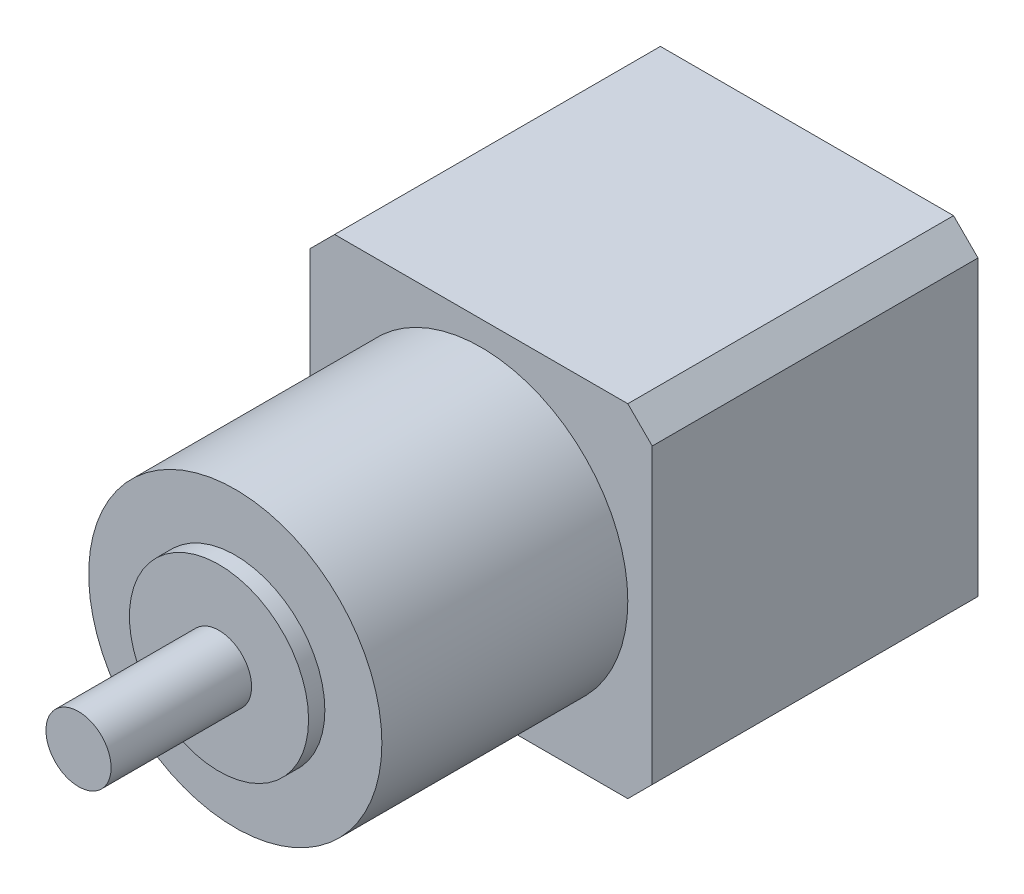
ISO-10303-21;
HEADER;
FILE_DESCRIPTION(('STEP AP214'),'2;1');
FILE_NAME('part.step','',(''),(''),'','','');
FILE_SCHEMA(('AUTOMOTIVE_DESIGN { 1 0 10303 214 1 1 1 1 }'));
ENDSEC;
DATA;
#1=APPLICATION_CONTEXT('core data for automotive mechanical design processes');
#2=APPLICATION_PROTOCOL_DEFINITION('international standard','automotive_design',2000,#1);
#3=PRODUCT_CONTEXT('',#1,'mechanical');
#4=PRODUCT('Part','Part','',(#3));
#5=PRODUCT_RELATED_PRODUCT_CATEGORY('part','',(#4));
#6=PRODUCT_DEFINITION_FORMATION('','',#4);
#7=PRODUCT_DEFINITION_CONTEXT('part definition',#1,'design');
#8=PRODUCT_DEFINITION('design','',#6,#7);
#9=PRODUCT_DEFINITION_SHAPE('','',#8);
#10=(LENGTH_UNIT() NAMED_UNIT(*) SI_UNIT(.MILLI.,.METRE.));
#11=(NAMED_UNIT(*) PLANE_ANGLE_UNIT() SI_UNIT($,.RADIAN.));
#12=(NAMED_UNIT(*) SI_UNIT($,.STERADIAN.) SOLID_ANGLE_UNIT());
#13=UNCERTAINTY_MEASURE_WITH_UNIT(LENGTH_MEASURE(1.E-05),#10,'distance_accuracy_value','');
#14=(GEOMETRIC_REPRESENTATION_CONTEXT(3) GLOBAL_UNCERTAINTY_ASSIGNED_CONTEXT((#13)) GLOBAL_UNIT_ASSIGNED_CONTEXT((#10,
#11,#12)) REPRESENTATION_CONTEXT('',''));
#15=CARTESIAN_POINT('',(0.,0.,0.));
#16=DIRECTION('',(0.,0.,1.));
#17=DIRECTION('',(1.,0.,0.));
#18=AXIS2_PLACEMENT_3D('',#15,#16,#17);
#19=CARTESIAN_POINT('',(-21.,-18.,40.));
#20=DIRECTION('',(1.,0.,0.));
#21=DIRECTION('',(0.,0.,-1.));
#22=AXIS2_PLACEMENT_3D('',#19,#20,#21);
#23=PLANE('',#22);
#24=DIRECTION('',(0.,-1.,0.));
#25=VECTOR('',#24,1.);
#26=CARTESIAN_POINT('',(-21.,-18.,0.));
#27=LINE('',#26,#25);
#28=CARTESIAN_POINT('',(-21.,18.,0.));
#29=VERTEX_POINT('',#28);
#30=CARTESIAN_POINT('',(-21.,-18.,0.));
#31=VERTEX_POINT('',#30);
#32=EDGE_CURVE('E132',#29,#31,#27,.T.);
#33=ORIENTED_EDGE('',*,*,#32,.T.);
#34=DIRECTION('',(0.,0.,-1.));
#35=VECTOR('',#34,1.);
#36=CARTESIAN_POINT('',(-21.,-18.,40.));
#37=LINE('',#36,#35);
#38=CARTESIAN_POINT('',(-21.,-18.,40.));
#39=VERTEX_POINT('',#38);
#40=EDGE_CURVE('E36',#39,#31,#37,.T.);
#41=ORIENTED_EDGE('',*,*,#40,.F.);
#42=DIRECTION('',(0.,-1.,0.));
#43=VECTOR('',#42,1.);
#44=CARTESIAN_POINT('',(-21.,-18.,40.));
#45=LINE('',#44,#43);
#46=CARTESIAN_POINT('',(-21.,18.,40.));
#47=VERTEX_POINT('',#46);
#48=EDGE_CURVE('E147',#47,#39,#45,.T.);
#49=ORIENTED_EDGE('',*,*,#48,.F.);
#50=DIRECTION('',(0.,0.,-1.));
#51=VECTOR('',#50,1.);
#52=CARTESIAN_POINT('',(-21.,18.,40.));
#53=LINE('',#52,#51);
#54=EDGE_CURVE('E128',#47,#29,#53,.T.);
#55=ORIENTED_EDGE('',*,*,#54,.T.);
#56=EDGE_LOOP('',(#33,#41,#49,#55));
#57=FACE_BOUND('',#56,.T.);
#58=ADVANCED_FACE('F33',(#57),#23,.F.);
#59=CARTESIAN_POINT('',(-21.,-18.,40.));
#60=DIRECTION('',(0.707106781186548,0.707106781186548,0.));
#61=DIRECTION('',(-0.707106781186548,0.707106781186548,0.));
#62=AXIS2_PLACEMENT_3D('',#59,#60,#61);
#63=PLANE('',#62);
#64=DIRECTION('',(0.707106781186548,-0.707106781186548,0.));
#65=VECTOR('',#64,1.);
#66=CARTESIAN_POINT('',(-21.,-18.,0.));
#67=LINE('',#66,#65);
#68=CARTESIAN_POINT('',(-18.,-21.,0.));
#69=VERTEX_POINT('',#68);
#70=EDGE_CURVE('E135',#31,#69,#67,.T.);
#71=ORIENTED_EDGE('',*,*,#70,.T.);
#72=DIRECTION('',(0.,0.,-1.));
#73=VECTOR('',#72,1.);
#74=CARTESIAN_POINT('',(-18.,-21.,40.));
#75=LINE('',#74,#73);
#76=CARTESIAN_POINT('',(-18.,-21.,40.));
#77=VERTEX_POINT('',#76);
#78=EDGE_CURVE('E156',#77,#69,#75,.T.);
#79=ORIENTED_EDGE('',*,*,#78,.F.);
#80=DIRECTION('',(0.707106781186548,-0.707106781186548,0.));
#81=VECTOR('',#80,1.);
#82=CARTESIAN_POINT('',(-21.,-18.,40.));
#83=LINE('',#82,#81);
#84=EDGE_CURVE('E95',#39,#77,#83,.T.);
#85=ORIENTED_EDGE('',*,*,#84,.F.);
#86=ORIENTED_EDGE('',*,*,#40,.T.);
#87=EDGE_LOOP('',(#71,#79,#85,#86));
#88=FACE_BOUND('',#87,.T.);
#89=ADVANCED_FACE('F202',(#88),#63,.F.);
#90=CARTESIAN_POINT('',(-18.,-21.,40.));
#91=DIRECTION('',(0.,1.,0.));
#92=DIRECTION('',(0.,0.,1.));
#93=AXIS2_PLACEMENT_3D('',#90,#91,#92);
#94=PLANE('',#93);
#95=DIRECTION('',(1.,0.,0.));
#96=VECTOR('',#95,1.);
#97=CARTESIAN_POINT('',(-18.,-21.,0.));
#98=LINE('',#97,#96);
#99=CARTESIAN_POINT('',(18.,-21.,0.));
#100=VERTEX_POINT('',#99);
#101=EDGE_CURVE('E138',#69,#100,#98,.T.);
#102=ORIENTED_EDGE('',*,*,#101,.T.);
#103=DIRECTION('',(0.,0.,-1.));
#104=VECTOR('',#103,1.);
#105=CARTESIAN_POINT('',(18.,-21.,40.));
#106=LINE('',#105,#104);
#107=CARTESIAN_POINT('',(18.,-21.,40.));
#108=VERTEX_POINT('',#107);
#109=EDGE_CURVE('E154',#108,#100,#106,.T.);
#110=ORIENTED_EDGE('',*,*,#109,.F.);
#111=DIRECTION('',(1.,0.,0.));
#112=VECTOR('',#111,1.);
#113=CARTESIAN_POINT('',(-18.,-21.,40.));
#114=LINE('',#113,#112);
#115=EDGE_CURVE('E173',#77,#108,#114,.T.);
#116=ORIENTED_EDGE('',*,*,#115,.F.);
#117=ORIENTED_EDGE('',*,*,#78,.T.);
#118=EDGE_LOOP('',(#102,#110,#116,#117));
#119=FACE_BOUND('',#118,.T.);
#120=ADVANCED_FACE('F206',(#119),#94,.F.);
#121=CARTESIAN_POINT('',(18.,-21.,40.));
#122=DIRECTION('',(-0.707106781186548,0.707106781186548,0.));
#123=DIRECTION('',(-0.707106781186548,-0.707106781186548,0.));
#124=AXIS2_PLACEMENT_3D('',#121,#122,#123);
#125=PLANE('',#124);
#126=DIRECTION('',(0.707106781186548,0.707106781186548,0.));
#127=VECTOR('',#126,1.);
#128=CARTESIAN_POINT('',(18.,-21.,0.));
#129=LINE('',#128,#127);
#130=CARTESIAN_POINT('',(21.,-18.,0.));
#131=VERTEX_POINT('',#130);
#132=EDGE_CURVE('E140',#100,#131,#129,.T.);
#133=ORIENTED_EDGE('',*,*,#132,.T.);
#134=DIRECTION('',(0.,0.,-1.));
#135=VECTOR('',#134,1.);
#136=CARTESIAN_POINT('',(21.,-18.,40.));
#137=LINE('',#136,#135);
#138=CARTESIAN_POINT('',(21.,-18.,40.));
#139=VERTEX_POINT('',#138);
#140=EDGE_CURVE('E151',#139,#131,#137,.T.);
#141=ORIENTED_EDGE('',*,*,#140,.F.);
#142=DIRECTION('',(0.707106781186548,0.707106781186548,0.));
#143=VECTOR('',#142,1.);
#144=CARTESIAN_POINT('',(18.,-21.,40.));
#145=LINE('',#144,#143);
#146=EDGE_CURVE('E175',#108,#139,#145,.T.);
#147=ORIENTED_EDGE('',*,*,#146,.F.);
#148=ORIENTED_EDGE('',*,*,#109,.T.);
#149=EDGE_LOOP('',(#133,#141,#147,#148));
#150=FACE_BOUND('',#149,.T.);
#151=ADVANCED_FACE('F180',(#150),#125,.F.);
#152=CARTESIAN_POINT('',(21.,-18.,40.));
#153=DIRECTION('',(-1.,0.,0.));
#154=DIRECTION('',(0.,0.,1.));
#155=AXIS2_PLACEMENT_3D('',#152,#153,#154);
#156=PLANE('',#155);
#157=DIRECTION('',(0.,1.,0.));
#158=VECTOR('',#157,1.);
#159=CARTESIAN_POINT('',(21.,-18.,0.));
#160=LINE('',#159,#158);
#161=CARTESIAN_POINT('',(21.,18.,0.));
#162=VERTEX_POINT('',#161);
#163=EDGE_CURVE('E142',#131,#162,#160,.T.);
#164=ORIENTED_EDGE('',*,*,#163,.T.);
#165=DIRECTION('',(0.,0.,-1.));
#166=VECTOR('',#165,1.);
#167=CARTESIAN_POINT('',(21.,18.,40.));
#168=LINE('',#167,#166);
#169=CARTESIAN_POINT('',(21.,18.,40.));
#170=VERTEX_POINT('',#169);
#171=EDGE_CURVE('E123',#170,#162,#168,.T.);
#172=ORIENTED_EDGE('',*,*,#171,.F.);
#173=DIRECTION('',(0.,1.,0.));
#174=VECTOR('',#173,1.);
#175=CARTESIAN_POINT('',(21.,-18.,40.));
#176=LINE('',#175,#174);
#177=EDGE_CURVE('E114',#139,#170,#176,.T.);
#178=ORIENTED_EDGE('',*,*,#177,.F.);
#179=ORIENTED_EDGE('',*,*,#140,.T.);
#180=EDGE_LOOP('',(#164,#172,#178,#179));
#181=FACE_BOUND('',#180,.T.);
#182=ADVANCED_FACE('F184',(#181),#156,.F.);
#183=CARTESIAN_POINT('',(18.,21.,40.));
#184=DIRECTION('',(-0.707106781186548,-0.707106781186548,0.));
#185=DIRECTION('',(0.707106781186548,-0.707106781186548,0.));
#186=AXIS2_PLACEMENT_3D('',#183,#184,#185);
#187=PLANE('',#186);
#188=DIRECTION('',(-0.707106781186548,0.707106781186548,0.));
#189=VECTOR('',#188,1.);
#190=CARTESIAN_POINT('',(18.,21.,0.));
#191=LINE('',#190,#189);
#192=CARTESIAN_POINT('',(18.,21.,0.));
#193=VERTEX_POINT('',#192);
#194=EDGE_CURVE('E122',#162,#193,#191,.T.);
#195=ORIENTED_EDGE('',*,*,#194,.T.);
#196=DIRECTION('',(0.,0.,-1.));
#197=VECTOR('',#196,1.);
#198=CARTESIAN_POINT('',(18.,21.,40.));
#199=LINE('',#198,#197);
#200=CARTESIAN_POINT('',(18.,21.,40.));
#201=VERTEX_POINT('',#200);
#202=EDGE_CURVE('E119',#201,#193,#199,.T.);
#203=ORIENTED_EDGE('',*,*,#202,.F.);
#204=DIRECTION('',(-0.707106781186548,0.707106781186548,0.));
#205=VECTOR('',#204,1.);
#206=CARTESIAN_POINT('',(18.,21.,40.));
#207=LINE('',#206,#205);
#208=EDGE_CURVE('E108',#170,#201,#207,.T.);
#209=ORIENTED_EDGE('',*,*,#208,.F.);
#210=ORIENTED_EDGE('',*,*,#171,.T.);
#211=EDGE_LOOP('',(#195,#203,#209,#210));
#212=FACE_BOUND('',#211,.T.);
#213=ADVANCED_FACE('F120',(#212),#187,.F.);
#214=CARTESIAN_POINT('',(-18.,21.,40.));
#215=DIRECTION('',(0.,-1.,0.));
#216=DIRECTION('',(0.,0.,-1.));
#217=AXIS2_PLACEMENT_3D('',#214,#215,#216);
#218=PLANE('',#217);
#219=DIRECTION('',(-1.,0.,0.));
#220=VECTOR('',#219,1.);
#221=CARTESIAN_POINT('',(-18.,21.,0.));
#222=LINE('',#221,#220);
#223=CARTESIAN_POINT('',(-18.,21.,0.));
#224=VERTEX_POINT('',#223);
#225=EDGE_CURVE('E80',#193,#224,#222,.T.);
#226=ORIENTED_EDGE('',*,*,#225,.T.);
#227=DIRECTION('',(0.,0.,-1.));
#228=VECTOR('',#227,1.);
#229=CARTESIAN_POINT('',(-18.,21.,40.));
#230=LINE('',#229,#228);
#231=CARTESIAN_POINT('',(-18.,21.,40.));
#232=VERTEX_POINT('',#231);
#233=EDGE_CURVE('E124',#232,#224,#230,.T.);
#234=ORIENTED_EDGE('',*,*,#233,.F.);
#235=DIRECTION('',(-1.,0.,0.));
#236=VECTOR('',#235,1.);
#237=CARTESIAN_POINT('',(-18.,21.,40.));
#238=LINE('',#237,#236);
#239=EDGE_CURVE('E112',#201,#232,#238,.T.);
#240=ORIENTED_EDGE('',*,*,#239,.F.);
#241=ORIENTED_EDGE('',*,*,#202,.T.);
#242=EDGE_LOOP('',(#226,#234,#240,#241));
#243=FACE_BOUND('',#242,.T.);
#244=ADVANCED_FACE('F126',(#243),#218,.F.);
#245=CARTESIAN_POINT('',(-21.,18.,40.));
#246=DIRECTION('',(0.707106781186548,-0.707106781186548,0.));
#247=DIRECTION('',(0.707106781186548,0.707106781186548,0.));
#248=AXIS2_PLACEMENT_3D('',#245,#246,#247);
#249=PLANE('',#248);
#250=DIRECTION('',(-0.707106781186548,-0.707106781186548,0.));
#251=VECTOR('',#250,1.);
#252=CARTESIAN_POINT('',(-21.,18.,0.));
#253=LINE('',#252,#251);
#254=EDGE_CURVE('E86',#224,#29,#253,.T.);
#255=ORIENTED_EDGE('',*,*,#254,.T.);
#256=ORIENTED_EDGE('',*,*,#54,.F.);
#257=DIRECTION('',(-0.707106781186548,-0.707106781186548,0.));
#258=VECTOR('',#257,1.);
#259=CARTESIAN_POINT('',(-21.,18.,40.));
#260=LINE('',#259,#258);
#261=EDGE_CURVE('E51',#232,#47,#260,.T.);
#262=ORIENTED_EDGE('',*,*,#261,.F.);
#263=ORIENTED_EDGE('',*,*,#233,.T.);
#264=EDGE_LOOP('',(#255,#256,#262,#263));
#265=FACE_BOUND('',#264,.T.);
#266=ADVANCED_FACE('F190',(#265),#249,.F.);
#267=CARTESIAN_POINT('',(0.,0.,40.));
#268=DIRECTION('',(0.,0.,-1.));
#269=DIRECTION('',(-1.,0.,0.));
#270=AXIS2_PLACEMENT_3D('',#267,#268,#269);
#271=PLANE('',#270);
#272=CARTESIAN_POINT('',(0.,0.,40.));
#273=DIRECTION('',(0.,0.,1.));
#274=DIRECTION('',(1.,0.,0.));
#275=AXIS2_PLACEMENT_3D('',#272,#273,#274);
#276=CIRCLE('',#275,18.);
#277=CARTESIAN_POINT('',(18.,0.,40.));
#278=VERTEX_POINT('',#277);
#279=EDGE_CURVE('E161',#278,#278,#276,.T.);
#280=ORIENTED_EDGE('',*,*,#279,.F.);
#281=EDGE_LOOP('',(#280));
#282=FACE_BOUND('',#281,.T.);
#283=ORIENTED_EDGE('',*,*,#48,.T.);
#284=ORIENTED_EDGE('',*,*,#84,.T.);
#285=ORIENTED_EDGE('',*,*,#115,.T.);
#286=ORIENTED_EDGE('',*,*,#146,.T.);
#287=ORIENTED_EDGE('',*,*,#177,.T.);
#288=ORIENTED_EDGE('',*,*,#208,.T.);
#289=ORIENTED_EDGE('',*,*,#239,.T.);
#290=ORIENTED_EDGE('',*,*,#261,.T.);
#291=EDGE_LOOP('',(#283,#284,#285,#286,#287,#288,#289,#290));
#292=FACE_BOUND('',#291,.T.);
#293=ADVANCED_FACE('F110',(#282,#292),#271,.F.);
#294=CARTESIAN_POINT('',(0.,0.,0.));
#295=DIRECTION('',(0.,0.,-1.));
#296=DIRECTION('',(-1.,0.,0.));
#297=AXIS2_PLACEMENT_3D('',#294,#295,#296);
#298=PLANE('',#297);
#299=ORIENTED_EDGE('',*,*,#32,.F.);
#300=ORIENTED_EDGE('',*,*,#254,.F.);
#301=ORIENTED_EDGE('',*,*,#225,.F.);
#302=ORIENTED_EDGE('',*,*,#194,.F.);
#303=ORIENTED_EDGE('',*,*,#163,.F.);
#304=ORIENTED_EDGE('',*,*,#132,.F.);
#305=ORIENTED_EDGE('',*,*,#101,.F.);
#306=ORIENTED_EDGE('',*,*,#70,.F.);
#307=EDGE_LOOP('',(#299,#300,#301,#302,#303,#304,#305,#306));
#308=FACE_BOUND('',#307,.T.);
#309=ADVANCED_FACE('F187',(#308),#298,.T.);
#310=CARTESIAN_POINT('',(0.,0.,70.2));
#311=DIRECTION('',(0.,0.,-1.));
#312=DIRECTION('',(-1.,0.,0.));
#313=AXIS2_PLACEMENT_3D('',#310,#311,#312);
#314=CYLINDRICAL_SURFACE('',#313,18.);
#315=CARTESIAN_POINT('',(0.,0.,70.2));
#316=DIRECTION('',(0.,0.,1.));
#317=DIRECTION('',(1.,0.,0.));
#318=AXIS2_PLACEMENT_3D('',#315,#316,#317);
#319=CIRCLE('',#318,18.);
#320=CARTESIAN_POINT('',(18.,0.,70.2));
#321=VERTEX_POINT('',#320);
#322=EDGE_CURVE('E136',#321,#321,#319,.T.);
#323=ORIENTED_EDGE('',*,*,#322,.F.);
#324=EDGE_LOOP('',(#323));
#325=FACE_BOUND('',#324,.T.);
#326=ORIENTED_EDGE('',*,*,#279,.T.);
#327=EDGE_LOOP('',(#326));
#328=FACE_BOUND('',#327,.T.);
#329=ADVANCED_FACE('F239',(#325,#328),#314,.T.);
#330=CARTESIAN_POINT('',(0.,0.,70.2));
#331=DIRECTION('',(0.,0.,1.));
#332=DIRECTION('',(1.,0.,0.));
#333=AXIS2_PLACEMENT_3D('',#330,#331,#332);
#334=PLANE('',#333);
#335=CARTESIAN_POINT('',(0.,0.,70.2));
#336=DIRECTION('',(0.,0.,1.));
#337=DIRECTION('',(1.,0.,0.));
#338=AXIS2_PLACEMENT_3D('',#335,#336,#337);
#339=CIRCLE('',#338,11.);
#340=CARTESIAN_POINT('',(11.,0.,70.2));
#341=VERTEX_POINT('',#340);
#342=EDGE_CURVE('E42',#341,#341,#339,.T.);
#343=ORIENTED_EDGE('',*,*,#342,.F.);
#344=EDGE_LOOP('',(#343));
#345=FACE_BOUND('',#344,.T.);
#346=ORIENTED_EDGE('',*,*,#322,.T.);
#347=EDGE_LOOP('',(#346));
#348=FACE_BOUND('',#347,.T.);
#349=ADVANCED_FACE('F252',(#345,#348),#334,.T.);
#350=CARTESIAN_POINT('',(0.,0.,72.2));
#351=DIRECTION('',(0.,0.,-1.));
#352=DIRECTION('',(-1.,0.,0.));
#353=AXIS2_PLACEMENT_3D('',#350,#351,#352);
#354=CYLINDRICAL_SURFACE('',#353,11.);
#355=CARTESIAN_POINT('',(0.,0.,72.2));
#356=DIRECTION('',(0.,0.,1.));
#357=DIRECTION('',(1.,0.,0.));
#358=AXIS2_PLACEMENT_3D('',#355,#356,#357);
#359=CIRCLE('',#358,11.);
#360=CARTESIAN_POINT('',(11.,0.,72.2));
#361=VERTEX_POINT('',#360);
#362=EDGE_CURVE('E309',#361,#361,#359,.T.);
#363=ORIENTED_EDGE('',*,*,#362,.F.);
#364=EDGE_LOOP('',(#363));
#365=FACE_BOUND('',#364,.T.);
#366=ORIENTED_EDGE('',*,*,#342,.T.);
#367=EDGE_LOOP('',(#366));
#368=FACE_BOUND('',#367,.T.);
#369=ADVANCED_FACE('F262',(#365,#368),#354,.T.);
#370=CARTESIAN_POINT('',(0.,0.,72.2));
#371=DIRECTION('',(0.,0.,1.));
#372=DIRECTION('',(1.,0.,0.));
#373=AXIS2_PLACEMENT_3D('',#370,#371,#372);
#374=PLANE('',#373);
#375=CARTESIAN_POINT('',(0.,0.,72.2));
#376=DIRECTION('',(0.,0.,1.));
#377=DIRECTION('',(1.,0.,0.));
#378=AXIS2_PLACEMENT_3D('',#375,#376,#377);
#379=CIRCLE('',#378,4.);
#380=CARTESIAN_POINT('',(4.,0.,72.2));
#381=VERTEX_POINT('',#380);
#382=EDGE_CURVE('E11',#381,#381,#379,.T.);
#383=ORIENTED_EDGE('',*,*,#382,.F.);
#384=EDGE_LOOP('',(#383));
#385=FACE_BOUND('',#384,.T.);
#386=ORIENTED_EDGE('',*,*,#362,.T.);
#387=EDGE_LOOP('',(#386));
#388=FACE_BOUND('',#387,.T.);
#389=ADVANCED_FACE('F272',(#385,#388),#374,.T.);
#390=CARTESIAN_POINT('',(0.,0.,89.45));
#391=DIRECTION('',(0.,0.,-1.));
#392=DIRECTION('',(-1.,0.,0.));
#393=AXIS2_PLACEMENT_3D('',#390,#391,#392);
#394=CYLINDRICAL_SURFACE('',#393,4.);
#395=CARTESIAN_POINT('',(0.,0.,89.45));
#396=DIRECTION('',(0.,0.,1.));
#397=DIRECTION('',(1.,0.,0.));
#398=AXIS2_PLACEMENT_3D('',#395,#396,#397);
#399=CIRCLE('',#398,4.);
#400=CARTESIAN_POINT('',(4.,0.,89.45));
#401=VERTEX_POINT('',#400);
#402=EDGE_CURVE('E308',#401,#401,#399,.T.);
#403=ORIENTED_EDGE('',*,*,#402,.F.);
#404=EDGE_LOOP('',(#403));
#405=FACE_BOUND('',#404,.T.);
#406=ORIENTED_EDGE('',*,*,#382,.T.);
#407=EDGE_LOOP('',(#406));
#408=FACE_BOUND('',#407,.T.);
#409=ADVANCED_FACE('F282',(#405,#408),#394,.T.);
#410=CARTESIAN_POINT('',(0.,0.,89.45));
#411=DIRECTION('',(0.,0.,1.));
#412=DIRECTION('',(1.,0.,0.));
#413=AXIS2_PLACEMENT_3D('',#410,#411,#412);
#414=PLANE('',#413);
#415=ORIENTED_EDGE('',*,*,#402,.T.);
#416=EDGE_LOOP('',(#415));
#417=FACE_BOUND('',#416,.T.);
#418=ADVANCED_FACE('F292',(#417),#414,.T.);
#419=CLOSED_SHELL('',(#58,#89,#120,#151,#182,#213,#244,#266,#293,#309,#329,#349,#369,#389,#409,#418));
#420=MANIFOLD_SOLID_BREP('B2',#419);
#421=ADVANCED_BREP_SHAPE_REPRESENTATION('',(#18,#420),#14);
#422=SHAPE_DEFINITION_REPRESENTATION(#9,#421);
ENDSEC;
END-ISO-10303-21;
